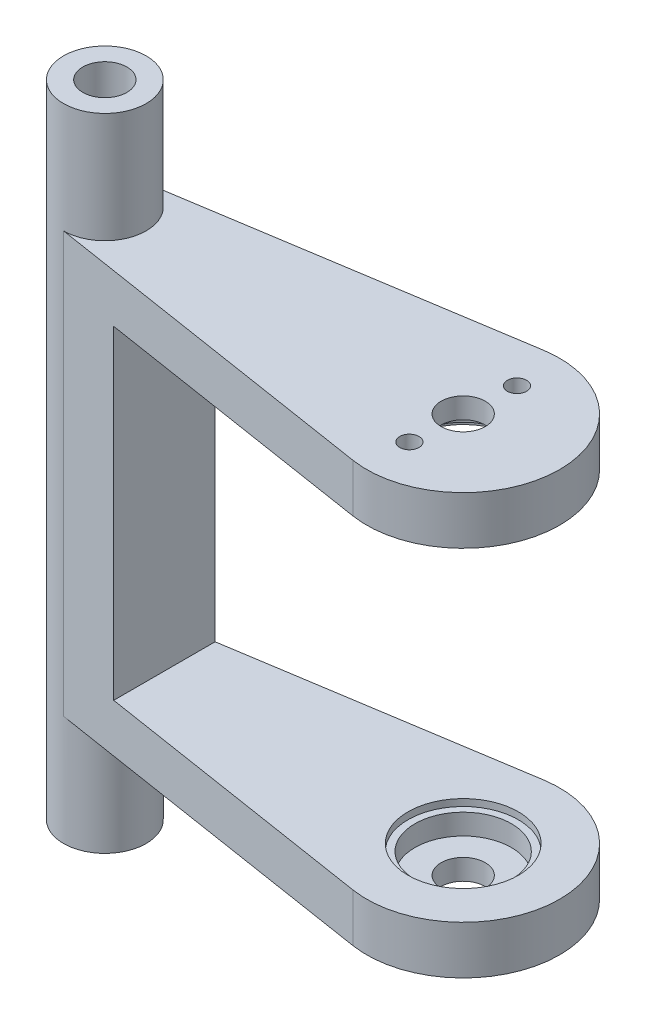
ISO-10303-21;
HEADER;
FILE_DESCRIPTION(('STEP AP214'),'2;1');
FILE_NAME('part.step','',(''),(''),'','','');
FILE_SCHEMA(('AUTOMOTIVE_DESIGN { 1 0 10303 214 1 1 1 1 }'));
ENDSEC;
DATA;
#1=APPLICATION_CONTEXT('core data for automotive mechanical design processes');
#2=APPLICATION_PROTOCOL_DEFINITION('international standard','automotive_design',2000,#1);
#3=PRODUCT_CONTEXT('',#1,'mechanical');
#4=PRODUCT('Part','Part','',(#3));
#5=PRODUCT_RELATED_PRODUCT_CATEGORY('part','',(#4));
#6=PRODUCT_DEFINITION_FORMATION('','',#4);
#7=PRODUCT_DEFINITION_CONTEXT('part definition',#1,'design');
#8=PRODUCT_DEFINITION('design','',#6,#7);
#9=PRODUCT_DEFINITION_SHAPE('','',#8);
#10=(LENGTH_UNIT() NAMED_UNIT(*) SI_UNIT(.MILLI.,.METRE.));
#11=(NAMED_UNIT(*) PLANE_ANGLE_UNIT() SI_UNIT($,.RADIAN.));
#12=(NAMED_UNIT(*) SI_UNIT($,.STERADIAN.) SOLID_ANGLE_UNIT());
#13=UNCERTAINTY_MEASURE_WITH_UNIT(LENGTH_MEASURE(1.E-05),#10,'distance_accuracy_value','');
#14=(GEOMETRIC_REPRESENTATION_CONTEXT(3) GLOBAL_UNCERTAINTY_ASSIGNED_CONTEXT((#13)) GLOBAL_UNIT_ASSIGNED_CONTEXT((#10,
#11,#12)) REPRESENTATION_CONTEXT('',''));
#15=CARTESIAN_POINT('',(0.,0.,0.));
#16=DIRECTION('',(0.,0.,1.));
#17=DIRECTION('',(1.,0.,0.));
#18=AXIS2_PLACEMENT_3D('',#15,#16,#17);
#19=CARTESIAN_POINT('',(0.,0.,0.));
#20=DIRECTION('',(0.,1.,0.));
#21=DIRECTION('',(0.,0.,1.));
#22=AXIS2_PLACEMENT_3D('',#19,#20,#21);
#23=PLANE('',#22);
#24=CARTESIAN_POINT('',(0.,0.,0.));
#25=DIRECTION('',(0.,1.,0.));
#26=DIRECTION('',(0.,0.,1.));
#27=AXIS2_PLACEMENT_3D('',#24,#25,#26);
#28=CIRCLE('',#27,3.2);
#29=CARTESIAN_POINT('',(0.,0.,3.2));
#30=VERTEX_POINT('',#29);
#31=EDGE_CURVE('E162',#30,#30,#28,.T.);
#32=ORIENTED_EDGE('',*,*,#31,.T.);
#33=EDGE_LOOP('',(#32));
#34=FACE_BOUND('',#33,.T.);
#35=CARTESIAN_POINT('',(-52.,0.,0.));
#36=DIRECTION('',(0.,-1.,0.));
#37=DIRECTION('',(0.,0.,-1.));
#38=AXIS2_PLACEMENT_3D('',#35,#36,#37);
#39=CIRCLE('',#38,5.99999999999999);
#40=CARTESIAN_POINT('',(-52.,0.,-5.99999999999999));
#41=VERTEX_POINT('',#40);
#42=CARTESIAN_POINT('',(-52.,0.,6.));
#43=VERTEX_POINT('',#42);
#44=EDGE_CURVE('E104',#41,#43,#39,.T.);
#45=ORIENTED_EDGE('',*,*,#44,.F.);
#46=DIRECTION('',(0.987875985661789,0.,-0.155245086726601));
#47=VECTOR('',#46,1.);
#48=CARTESIAN_POINT('',(-2.17343127995814,0.,-13.8302642178814));
#49=LINE('',#48,#47);
#50=CARTESIAN_POINT('',(-2.17343127995814,0.,-13.8302642178814));
#51=VERTEX_POINT('',#50);
#52=EDGE_CURVE('E86',#41,#51,#49,.T.);
#53=ORIENTED_EDGE('',*,*,#52,.T.);
#54=CARTESIAN_POINT('',(0.,0.,0.));
#55=DIRECTION('',(0.,1.,0.));
#56=DIRECTION('',(0.,0.,1.));
#57=AXIS2_PLACEMENT_3D('',#54,#55,#56);
#58=CIRCLE('',#57,14.000000423754);
#59=CARTESIAN_POINT('',(-2.17343127995814,0.,13.8302642178814));
#60=VERTEX_POINT('',#59);
#61=EDGE_CURVE('E95',#60,#51,#58,.T.);
#62=ORIENTED_EDGE('',*,*,#61,.F.);
#63=DIRECTION('',(0.987875985661789,0.,0.155245086726601));
#64=VECTOR('',#63,1.);
#65=CARTESIAN_POINT('',(-2.17343127995814,0.,13.8302642178814));
#66=LINE('',#65,#64);
#67=EDGE_CURVE('E101',#43,#60,#66,.T.);
#68=ORIENTED_EDGE('',*,*,#67,.F.);
#69=EDGE_LOOP('',(#45,#53,#62,#68));
#70=FACE_BOUND('',#69,.T.);
#71=ADVANCED_FACE('F39',(#34,#70),#23,.F.);
#72=CARTESIAN_POINT('',(0.,3.,0.));
#73=DIRECTION('',(0.,1.,0.));
#74=DIRECTION('',(0.,0.,1.));
#75=AXIS2_PLACEMENT_3D('',#72,#73,#74);
#76=CYLINDRICAL_SURFACE('',#75,7.);
#77=CARTESIAN_POINT('',(0.,3.,0.));
#78=DIRECTION('',(0.,1.,0.));
#79=DIRECTION('',(0.,0.,1.));
#80=AXIS2_PLACEMENT_3D('',#77,#78,#79);
#81=CIRCLE('',#80,7.);
#82=CARTESIAN_POINT('',(0.,3.,7.));
#83=VERTEX_POINT('',#82);
#84=EDGE_CURVE('E134',#83,#83,#81,.T.);
#85=ORIENTED_EDGE('',*,*,#84,.F.);
#86=EDGE_LOOP('',(#85));
#87=FACE_BOUND('',#86,.T.);
#88=CARTESIAN_POINT('',(0.,6.,0.));
#89=DIRECTION('',(0.,1.,0.));
#90=DIRECTION('',(0.,0.,1.));
#91=AXIS2_PLACEMENT_3D('',#88,#89,#90);
#92=CIRCLE('',#91,7.);
#93=CARTESIAN_POINT('',(0.,6.,7.));
#94=VERTEX_POINT('',#93);
#95=EDGE_CURVE('E43',#94,#94,#92,.F.);
#96=ORIENTED_EDGE('',*,*,#95,.F.);
#97=EDGE_LOOP('',(#96));
#98=FACE_BOUND('',#97,.T.);
#99=ADVANCED_FACE('F307',(#87,#98),#76,.F.);
#100=CARTESIAN_POINT('',(0.,0.,0.));
#101=DIRECTION('',(0.,1.,0.));
#102=DIRECTION('',(0.,0.,1.));
#103=AXIS2_PLACEMENT_3D('',#100,#101,#102);
#104=CYLINDRICAL_SURFACE('',#103,3.2);
#105=CARTESIAN_POINT('',(0.,3.,0.));
#106=DIRECTION('',(0.,1.,0.));
#107=DIRECTION('',(0.,0.,1.));
#108=AXIS2_PLACEMENT_3D('',#105,#106,#107);
#109=CIRCLE('',#108,3.2);
#110=CARTESIAN_POINT('',(0.,3.,3.2));
#111=VERTEX_POINT('',#110);
#112=EDGE_CURVE('E130',#111,#111,#109,.F.);
#113=CARTESIAN_POINT('',(0.,0.,3.2));
#114=CARTESIAN_POINT('',(0.,0.03125,3.2));
#115=CARTESIAN_POINT('',(0.,0.0625,3.2));
#116=CARTESIAN_POINT('',(0.,0.125,3.2));
#117=CARTESIAN_POINT('',(0.,0.15625,3.2));
#118=CARTESIAN_POINT('',(0.,0.21875,3.2));
#119=CARTESIAN_POINT('',(0.,0.25,3.2));
#120=CARTESIAN_POINT('',(0.,0.3125,3.2));
#121=CARTESIAN_POINT('',(0.,0.34375,3.2));
#122=CARTESIAN_POINT('',(0.,0.40625,3.2));
#123=CARTESIAN_POINT('',(0.,0.4375,3.2));
#124=CARTESIAN_POINT('',(0.,0.5,3.2));
#125=CARTESIAN_POINT('',(0.,0.53125,3.2));
#126=CARTESIAN_POINT('',(0.,0.59375,3.2));
#127=CARTESIAN_POINT('',(0.,0.625,3.2));
#128=CARTESIAN_POINT('',(0.,0.6875,3.2));
#129=CARTESIAN_POINT('',(0.,0.71875,3.2));
#130=CARTESIAN_POINT('',(0.,0.78125,3.2));
#131=CARTESIAN_POINT('',(0.,0.8125,3.2));
#132=CARTESIAN_POINT('',(0.,0.875,3.2));
#133=CARTESIAN_POINT('',(0.,0.90625,3.2));
#134=CARTESIAN_POINT('',(0.,0.96875,3.2));
#135=CARTESIAN_POINT('',(0.,1.,3.2));
#136=CARTESIAN_POINT('',(0.,1.0625,3.2));
#137=CARTESIAN_POINT('',(0.,1.09375,3.2));
#138=CARTESIAN_POINT('',(0.,1.15625,3.2));
#139=CARTESIAN_POINT('',(0.,1.1875,3.2));
#140=CARTESIAN_POINT('',(0.,1.25,3.2));
#141=CARTESIAN_POINT('',(0.,1.28125,3.2));
#142=CARTESIAN_POINT('',(0.,1.34375,3.2));
#143=CARTESIAN_POINT('',(0.,1.375,3.2));
#144=CARTESIAN_POINT('',(0.,1.4375,3.2));
#145=CARTESIAN_POINT('',(0.,1.46875,3.2));
#146=CARTESIAN_POINT('',(0.,1.53125,3.2));
#147=CARTESIAN_POINT('',(0.,1.5625,3.2));
#148=CARTESIAN_POINT('',(0.,1.625,3.2));
#149=CARTESIAN_POINT('',(0.,1.65625,3.2));
#150=CARTESIAN_POINT('',(0.,1.71875,3.2));
#151=CARTESIAN_POINT('',(0.,1.75,3.2));
#152=CARTESIAN_POINT('',(0.,1.8125,3.2));
#153=CARTESIAN_POINT('',(0.,1.84375,3.2));
#154=CARTESIAN_POINT('',(0.,1.90625,3.2));
#155=CARTESIAN_POINT('',(0.,1.9375,3.2));
#156=CARTESIAN_POINT('',(0.,2.,3.2));
#157=CARTESIAN_POINT('',(0.,2.03125,3.2));
#158=CARTESIAN_POINT('',(0.,2.09375,3.2));
#159=CARTESIAN_POINT('',(0.,2.125,3.2));
#160=CARTESIAN_POINT('',(0.,2.1875,3.2));
#161=CARTESIAN_POINT('',(0.,2.21875,3.2));
#162=CARTESIAN_POINT('',(0.,2.28125,3.2));
#163=CARTESIAN_POINT('',(0.,2.3125,3.2));
#164=CARTESIAN_POINT('',(0.,2.375,3.2));
#165=CARTESIAN_POINT('',(0.,2.40625,3.2));
#166=CARTESIAN_POINT('',(0.,2.46875,3.2));
#167=CARTESIAN_POINT('',(0.,2.5,3.2));
#168=CARTESIAN_POINT('',(0.,2.5625,3.2));
#169=CARTESIAN_POINT('',(0.,2.59375,3.2));
#170=CARTESIAN_POINT('',(0.,2.65625,3.2));
#171=CARTESIAN_POINT('',(0.,2.6875,3.2));
#172=CARTESIAN_POINT('',(0.,2.75,3.2));
#173=CARTESIAN_POINT('',(0.,2.78125,3.2));
#174=CARTESIAN_POINT('',(0.,2.84375,3.2));
#175=CARTESIAN_POINT('',(0.,2.875,3.2));
#176=CARTESIAN_POINT('',(0.,2.9375,3.2));
#177=CARTESIAN_POINT('',(0.,2.96875,3.2));
#178=CARTESIAN_POINT('',(0.,3.,3.2));
#179=B_SPLINE_CURVE_WITH_KNOTS('',3,(#113,#114,#115,#116,#117,#118,#119,#120,#121,#122,#123,
#124,#125,#126,#127,#128,#129,#130,#131,#132,#133,#134,#135,#136,#137,#138,#139,#140,#141,#142,
#143,#144,#145,#146,#147,#148,#149,#150,#151,#152,#153,#154,#155,#156,#157,#158,#159,#160,#161,
#162,#163,#164,#165,#166,#167,#168,#169,#170,#171,#172,#173,#174,#175,#176,#177,#178),
.UNSPECIFIED.,.F.,.F.,(4,2,2,2,2,2,2,2,2,2,2,2,2,2,2,2,2,2,2,2,2,2,2,2,2,2,2,2,2,2,2,2,4),(0.,
0.09375,0.1875,0.28125,0.375,0.46875,0.5625,0.65625,0.75,0.84375,0.9375,1.03125,1.125,1.21875,
1.3125,1.40625,1.5,1.59375,1.6875,1.78125,1.875,1.96875,2.0625,2.15625,2.25,2.34375,2.4375,
2.53125,2.625,2.71875,2.8125,2.90625,3.),.UNSPECIFIED.);
#180=EDGE_CURVE('BSEAM303',#30,#111,#179,.T.);
#181=ORIENTED_EDGE('',*,*,#31,.F.);
#182=ORIENTED_EDGE('',*,*,#112,.F.);
#183=ORIENTED_EDGE('',*,*,#180,.T.);
#184=ORIENTED_EDGE('',*,*,#180,.F.);
#185=EDGE_LOOP('',(#181,#183,#182,#184));
#186=FACE_BOUND('',#185,.T.);
#187=ADVANCED_FACE('F303',(#186),#104,.F.);
#188=CARTESIAN_POINT('',(0.,58.,0.));
#189=DIRECTION('',(0.,-1.,0.));
#190=DIRECTION('',(0.,0.,-1.));
#191=AXIS2_PLACEMENT_3D('',#188,#189,#190);
#192=CYLINDRICAL_SURFACE('',#191,7.);
#193=CARTESIAN_POINT('',(0.,58.,0.));
#194=DIRECTION('',(0.,-1.,0.));
#195=DIRECTION('',(0.,0.,-1.));
#196=AXIS2_PLACEMENT_3D('',#193,#194,#195);
#197=CIRCLE('',#196,7.);
#198=CARTESIAN_POINT('',(0.,58.,-7.));
#199=VERTEX_POINT('',#198);
#200=EDGE_CURVE('E125',#199,#199,#197,.T.);
#201=ORIENTED_EDGE('',*,*,#200,.F.);
#202=EDGE_LOOP('',(#201));
#203=FACE_BOUND('',#202,.T.);
#204=CARTESIAN_POINT('',(0.,55.,0.));
#205=DIRECTION('',(0.,-1.,0.));
#206=DIRECTION('',(0.,0.,-1.));
#207=AXIS2_PLACEMENT_3D('',#204,#205,#206);
#208=CIRCLE('',#207,7.);
#209=CARTESIAN_POINT('',(0.,55.,-7.));
#210=VERTEX_POINT('',#209);
#211=EDGE_CURVE('E126',#210,#210,#208,.F.);
#212=ORIENTED_EDGE('',*,*,#211,.F.);
#213=EDGE_LOOP('',(#212));
#214=FACE_BOUND('',#213,.T.);
#215=ADVANCED_FACE('F300',(#203,#214),#192,.F.);
#216=CARTESIAN_POINT('',(0.,61.,0.));
#217=DIRECTION('',(0.,1.,0.));
#218=DIRECTION('',(0.,0.,1.));
#219=AXIS2_PLACEMENT_3D('',#216,#217,#218);
#220=CIRCLE('',#219,3.2);
#221=CARTESIAN_POINT('',(0.,61.,3.2));
#222=VERTEX_POINT('',#221);
#223=EDGE_CURVE('E177',#222,#222,#220,.T.);
#224=CARTESIAN_POINT('',(0.,58.,0.));
#225=DIRECTION('',(0.,-1.,0.));
#226=DIRECTION('',(0.,0.,-1.));
#227=AXIS2_PLACEMENT_3D('',#224,#225,#226);
#228=CIRCLE('',#227,3.2);
#229=CARTESIAN_POINT('',(0.,58.,3.2));
#230=VERTEX_POINT('',#229);
#231=EDGE_CURVE('E120',#230,#230,#228,.F.);
#232=CARTESIAN_POINT('',(0.,61.,3.2));
#233=CARTESIAN_POINT('',(0.,60.96875,3.2));
#234=CARTESIAN_POINT('',(0.,60.9375,3.2));
#235=CARTESIAN_POINT('',(0.,60.875,3.2));
#236=CARTESIAN_POINT('',(0.,60.84375,3.2));
#237=CARTESIAN_POINT('',(0.,60.78125,3.2));
#238=CARTESIAN_POINT('',(0.,60.75,3.2));
#239=CARTESIAN_POINT('',(0.,60.6875,3.2));
#240=CARTESIAN_POINT('',(0.,60.65625,3.2));
#241=CARTESIAN_POINT('',(0.,60.59375,3.2));
#242=CARTESIAN_POINT('',(0.,60.5625,3.2));
#243=CARTESIAN_POINT('',(0.,60.5,3.2));
#244=CARTESIAN_POINT('',(0.,60.46875,3.2));
#245=CARTESIAN_POINT('',(0.,60.40625,3.2));
#246=CARTESIAN_POINT('',(0.,60.375,3.2));
#247=CARTESIAN_POINT('',(0.,60.3125,3.2));
#248=CARTESIAN_POINT('',(0.,60.28125,3.2));
#249=CARTESIAN_POINT('',(0.,60.21875,3.2));
#250=CARTESIAN_POINT('',(0.,60.1875,3.2));
#251=CARTESIAN_POINT('',(0.,60.125,3.2));
#252=CARTESIAN_POINT('',(0.,60.09375,3.2));
#253=CARTESIAN_POINT('',(0.,60.03125,3.2));
#254=CARTESIAN_POINT('',(0.,60.,3.2));
#255=CARTESIAN_POINT('',(0.,59.9375,3.2));
#256=CARTESIAN_POINT('',(0.,59.90625,3.2));
#257=CARTESIAN_POINT('',(0.,59.84375,3.2));
#258=CARTESIAN_POINT('',(0.,59.8125,3.2));
#259=CARTESIAN_POINT('',(0.,59.75,3.2));
#260=CARTESIAN_POINT('',(0.,59.71875,3.2));
#261=CARTESIAN_POINT('',(0.,59.65625,3.2));
#262=CARTESIAN_POINT('',(0.,59.625,3.2));
#263=CARTESIAN_POINT('',(0.,59.5625,3.2));
#264=CARTESIAN_POINT('',(0.,59.53125,3.2));
#265=CARTESIAN_POINT('',(0.,59.46875,3.2));
#266=CARTESIAN_POINT('',(0.,59.4375,3.2));
#267=CARTESIAN_POINT('',(0.,59.375,3.2));
#268=CARTESIAN_POINT('',(0.,59.34375,3.2));
#269=CARTESIAN_POINT('',(0.,59.28125,3.2));
#270=CARTESIAN_POINT('',(0.,59.25,3.2));
#271=CARTESIAN_POINT('',(0.,59.1875,3.2));
#272=CARTESIAN_POINT('',(0.,59.15625,3.2));
#273=CARTESIAN_POINT('',(0.,59.09375,3.2));
#274=CARTESIAN_POINT('',(0.,59.0625,3.2));
#275=CARTESIAN_POINT('',(0.,59.,3.2));
#276=CARTESIAN_POINT('',(0.,58.96875,3.2));
#277=CARTESIAN_POINT('',(0.,58.90625,3.2));
#278=CARTESIAN_POINT('',(0.,58.875,3.2));
#279=CARTESIAN_POINT('',(0.,58.8125,3.2));
#280=CARTESIAN_POINT('',(0.,58.78125,3.2));
#281=CARTESIAN_POINT('',(0.,58.71875,3.2));
#282=CARTESIAN_POINT('',(0.,58.6875,3.2));
#283=CARTESIAN_POINT('',(0.,58.625,3.2));
#284=CARTESIAN_POINT('',(0.,58.59375,3.2));
#285=CARTESIAN_POINT('',(0.,58.53125,3.2));
#286=CARTESIAN_POINT('',(0.,58.5,3.2));
#287=CARTESIAN_POINT('',(0.,58.4375,3.2));
#288=CARTESIAN_POINT('',(0.,58.40625,3.2));
#289=CARTESIAN_POINT('',(0.,58.34375,3.2));
#290=CARTESIAN_POINT('',(0.,58.3125,3.2));
#291=CARTESIAN_POINT('',(0.,58.25,3.2));
#292=CARTESIAN_POINT('',(0.,58.21875,3.2));
#293=CARTESIAN_POINT('',(0.,58.15625,3.2));
#294=CARTESIAN_POINT('',(0.,58.125,3.2));
#295=CARTESIAN_POINT('',(0.,58.0625,3.2));
#296=CARTESIAN_POINT('',(0.,58.03125,3.2));
#297=CARTESIAN_POINT('',(0.,58.,3.2));
#298=B_SPLINE_CURVE_WITH_KNOTS('',3,(#232,#233,#234,#235,#236,#237,#238,#239,#240,#241,#242,
#243,#244,#245,#246,#247,#248,#249,#250,#251,#252,#253,#254,#255,#256,#257,#258,#259,#260,#261,
#262,#263,#264,#265,#266,#267,#268,#269,#270,#271,#272,#273,#274,#275,#276,#277,#278,#279,#280,
#281,#282,#283,#284,#285,#286,#287,#288,#289,#290,#291,#292,#293,#294,#295,#296,#297),
.UNSPECIFIED.,.F.,.F.,(4,2,2,2,2,2,2,2,2,2,2,2,2,2,2,2,2,2,2,2,2,2,2,2,2,2,2,2,2,2,2,2,4),(0.,
0.0937499999999966,0.1875,0.281249999999997,0.375,0.468749999999997,0.5625,0.656249999999997,
0.750000000000001,0.843749999999997,0.937499999999994,1.03125,1.12499999999999,1.21875,
1.31249999999999,1.40625,1.49999999999999,1.59374999999999,1.68749999999999,1.78124999999999,
1.87499999999999,1.96874999999999,2.06249999999999,2.15624999999999,2.24999999999999,
2.34374999999999,2.43749999999999,2.53124999999999,2.62499999999999,2.71874999999999,
2.81249999999999,2.90624999999999,2.99999999999999),.UNSPECIFIED.);
#299=EDGE_CURVE('BSEAM294',#222,#230,#298,.T.);
#300=ORIENTED_EDGE('',*,*,#223,.T.);
#301=ORIENTED_EDGE('',*,*,#231,.F.);
#302=ORIENTED_EDGE('',*,*,#299,.T.);
#303=ORIENTED_EDGE('',*,*,#299,.F.);
#304=EDGE_LOOP('',(#300,#302,#301,#303));
#305=FACE_BOUND('',#304,.T.);
#306=ADVANCED_FACE('F294',(#305),#104,.F.);
#307=CARTESIAN_POINT('',(0.,7.,0.));
#308=DIRECTION('',(0.,1.,0.));
#309=DIRECTION('',(0.,0.,1.));
#310=AXIS2_PLACEMENT_3D('',#307,#308,#309);
#311=PLANE('',#310);
#312=CARTESIAN_POINT('',(0.,7.,0.));
#313=DIRECTION('',(0.,1.,0.));
#314=DIRECTION('',(0.,0.,1.));
#315=AXIS2_PLACEMENT_3D('',#312,#313,#314);
#316=CIRCLE('',#315,8.);
#317=CARTESIAN_POINT('',(0.,7.,8.));
#318=VERTEX_POINT('',#317);
#319=EDGE_CURVE('E150',#318,#318,#316,.T.);
#320=ORIENTED_EDGE('',*,*,#319,.F.);
#321=EDGE_LOOP('',(#320));
#322=FACE_BOUND('',#321,.T.);
#323=DIRECTION('',(0.987875985661789,0.,-0.155245086726601));
#324=VECTOR('',#323,1.);
#325=CARTESIAN_POINT('',(-2.17343127995814,7.,-13.8302642178814));
#326=LINE('',#325,#324);
#327=CARTESIAN_POINT('',(-43.3576983044888,7.,-7.35814099715995));
#328=VERTEX_POINT('',#327);
#329=CARTESIAN_POINT('',(-2.17343127995814,7.,-13.8302642178814));
#330=VERTEX_POINT('',#329);
#331=EDGE_CURVE('E66',#328,#330,#326,.T.);
#332=ORIENTED_EDGE('',*,*,#331,.F.);
#333=DIRECTION('',(0.,0.,1.));
#334=VECTOR('',#333,1.);
#335=CARTESIAN_POINT('',(-43.3576983044888,7.,0.));
#336=LINE('',#335,#334);
#337=CARTESIAN_POINT('',(-43.3576983044888,7.,7.35814099715996));
#338=VERTEX_POINT('',#337);
#339=EDGE_CURVE('E217',#328,#338,#336,.T.);
#340=ORIENTED_EDGE('',*,*,#339,.T.);
#341=DIRECTION('',(0.987875985661789,0.,0.155245086726601));
#342=VECTOR('',#341,1.);
#343=CARTESIAN_POINT('',(-2.17343127995814,7.,13.8302642178814));
#344=LINE('',#343,#342);
#345=CARTESIAN_POINT('',(-2.17343127995814,7.,13.8302642178814));
#346=VERTEX_POINT('',#345);
#347=EDGE_CURVE('E226',#338,#346,#344,.T.);
#348=ORIENTED_EDGE('',*,*,#347,.T.);
#349=CARTESIAN_POINT('',(0.,7.,0.));
#350=DIRECTION('',(0.,1.,0.));
#351=DIRECTION('',(0.,0.,1.));
#352=AXIS2_PLACEMENT_3D('',#349,#350,#351);
#353=CIRCLE('',#352,14.000000423754);
#354=EDGE_CURVE('E91',#346,#330,#353,.T.);
#355=ORIENTED_EDGE('',*,*,#354,.T.);
#356=EDGE_LOOP('',(#332,#340,#348,#355));
#357=FACE_BOUND('',#356,.T.);
#358=ADVANCED_FACE('F231',(#322,#357),#311,.T.);
#359=CARTESIAN_POINT('',(-2.17343127995814,7.,-13.8302642178814));
#360=DIRECTION('',(-0.155245086726601,0.,-0.987875985661788));
#361=DIRECTION('',(-0.987875985661788,0.,0.155245086726601));
#362=AXIS2_PLACEMENT_3D('',#359,#360,#361);
#363=PLANE('',#362);
#364=ORIENTED_EDGE('',*,*,#52,.F.);
#365=DIRECTION('',(0.,-1.,0.));
#366=VECTOR('',#365,1.);
#367=CARTESIAN_POINT('',(-52.,7.,-5.99999999999999));
#368=LINE('',#367,#366);
#369=CARTESIAN_POINT('',(-52.,61.,-5.99999999999999));
#370=VERTEX_POINT('',#369);
#371=EDGE_CURVE('E11',#370,#41,#368,.T.);
#372=ORIENTED_EDGE('',*,*,#371,.F.);
#373=DIRECTION('',(-0.987875985661789,0.,0.155245086726601));
#374=VECTOR('',#373,1.);
#375=CARTESIAN_POINT('',(-2.17343127995814,61.,-13.8302642178814));
#376=LINE('',#375,#374);
#377=CARTESIAN_POINT('',(-43.3576983044889,61.,-7.35814099715995));
#378=VERTEX_POINT('',#377);
#379=EDGE_CURVE('E182',#378,#370,#376,.T.);
#380=ORIENTED_EDGE('',*,*,#379,.F.);
#381=DIRECTION('',(0.98787598804435,0.,-0.155245071565571));
#382=VECTOR('',#381,1.);
#383=CARTESIAN_POINT('',(-2.17343106770371,61.,-13.8302642512373));
#384=LINE('',#383,#382);
#385=CARTESIAN_POINT('',(-2.17343106770371,61.,-13.8302642512373));
#386=VERTEX_POINT('',#385);
#387=EDGE_CURVE('E195',#378,#386,#384,.T.);
#388=ORIENTED_EDGE('',*,*,#387,.T.);
#389=DIRECTION('',(0.,-1.,0.));
#390=VECTOR('',#389,1.);
#391=CARTESIAN_POINT('',(-2.17343106770371,61.,-13.8302642512373));
#392=LINE('',#391,#390);
#393=CARTESIAN_POINT('',(-2.17343106770371,54.,-13.8302642512373));
#394=VERTEX_POINT('',#393);
#395=EDGE_CURVE('E199',#386,#394,#392,.T.);
#396=ORIENTED_EDGE('',*,*,#395,.T.);
#397=DIRECTION('',(0.98787598804435,0.,-0.155245071565571));
#398=VECTOR('',#397,1.);
#399=CARTESIAN_POINT('',(-2.17343106770371,54.,-13.8302642512373));
#400=LINE('',#399,#398);
#401=CARTESIAN_POINT('',(-43.3576983044889,54.,-7.35814099715995));
#402=VERTEX_POINT('',#401);
#403=EDGE_CURVE('E187',#402,#394,#400,.T.);
#404=ORIENTED_EDGE('',*,*,#403,.F.);
#405=DIRECTION('',(0.,-1.,0.));
#406=VECTOR('',#405,1.);
#407=CARTESIAN_POINT('',(-43.3576983044888,54.,-7.35814099715995));
#408=LINE('',#407,#406);
#409=EDGE_CURVE('E110',#402,#328,#408,.T.);
#410=ORIENTED_EDGE('',*,*,#409,.T.);
#411=ORIENTED_EDGE('',*,*,#331,.T.);
#412=DIRECTION('',(0.,-1.,0.));
#413=VECTOR('',#412,1.);
#414=CARTESIAN_POINT('',(-2.17343127995814,7.,-13.8302642178814));
#415=LINE('',#414,#413);
#416=EDGE_CURVE('E81',#330,#51,#415,.T.);
#417=ORIENTED_EDGE('',*,*,#416,.T.);
#418=EDGE_LOOP('',(#364,#372,#380,#388,#396,#404,#410,#411,#417));
#419=FACE_BOUND('',#418,.T.);
#420=ADVANCED_FACE('F41',(#419),#363,.T.);
#421=CARTESIAN_POINT('',(-52.,7.,0.));
#422=DIRECTION('',(0.,-1.,0.));
#423=DIRECTION('',(0.,0.,-1.));
#424=AXIS2_PLACEMENT_3D('',#421,#422,#423);
#425=CYLINDRICAL_SURFACE('',#424,5.99999999999999);
#426=ORIENTED_EDGE('',*,*,#371,.T.);
#427=ORIENTED_EDGE('',*,*,#44,.T.);
#428=DIRECTION('',(0.,-1.,0.));
#429=VECTOR('',#428,1.);
#430=CARTESIAN_POINT('',(-52.,7.,6.));
#431=LINE('',#430,#429);
#432=CARTESIAN_POINT('',(-52.,61.,6.));
#433=VERTEX_POINT('',#432);
#434=EDGE_CURVE('E49',#433,#43,#431,.T.);
#435=ORIENTED_EDGE('',*,*,#434,.F.);
#436=CARTESIAN_POINT('',(-52.,61.,0.));
#437=DIRECTION('',(0.,1.,0.));
#438=DIRECTION('',(0.,0.,1.));
#439=AXIS2_PLACEMENT_3D('',#436,#437,#438);
#440=CIRCLE('',#439,5.99999999999999);
#441=EDGE_CURVE('E268',#433,#370,#440,.T.);
#442=ORIENTED_EDGE('',*,*,#441,.T.);
#443=EDGE_LOOP('',(#426,#427,#435,#442));
#444=FACE_BOUND('',#443,.T.);
#445=CARTESIAN_POINT('',(-52.,77.,0.));
#446=DIRECTION('',(0.,1.,0.));
#447=DIRECTION('',(0.,0.,1.));
#448=AXIS2_PLACEMENT_3D('',#445,#446,#447);
#449=CIRCLE('',#448,5.99999999999999);
#450=CARTESIAN_POINT('',(-52.,77.,6.));
#451=VERTEX_POINT('',#450);
#452=EDGE_CURVE('E273',#451,#451,#449,.T.);
#453=ORIENTED_EDGE('',*,*,#452,.F.);
#454=EDGE_LOOP('',(#453));
#455=FACE_BOUND('',#454,.T.);
#456=CARTESIAN_POINT('',(-52.,-16.,0.));
#457=DIRECTION('',(0.,-1.,0.));
#458=DIRECTION('',(0.,0.,-1.));
#459=AXIS2_PLACEMENT_3D('',#456,#457,#458);
#460=CIRCLE('',#459,5.99999999999999);
#461=CARTESIAN_POINT('',(-52.,-16.,-5.99999999999999));
#462=VERTEX_POINT('',#461);
#463=EDGE_CURVE('E281',#462,#462,#460,.T.);
#464=ORIENTED_EDGE('',*,*,#463,.F.);
#465=EDGE_LOOP('',(#464));
#466=FACE_BOUND('',#465,.T.);
#467=ADVANCED_FACE('F266',(#444,#455,#466),#425,.T.);
#468=CARTESIAN_POINT('',(-2.17343127995814,7.,13.8302642178814));
#469=DIRECTION('',(0.155245086726601,0.,-0.987875985661788));
#470=DIRECTION('',(-0.987875985661788,0.,-0.155245086726601));
#471=AXIS2_PLACEMENT_3D('',#468,#469,#470);
#472=PLANE('',#471);
#473=ORIENTED_EDGE('',*,*,#67,.T.);
#474=DIRECTION('',(0.,-1.,0.));
#475=VECTOR('',#474,1.);
#476=CARTESIAN_POINT('',(-2.17343127995814,7.,13.8302642178814));
#477=LINE('',#476,#475);
#478=EDGE_CURVE('E90',#346,#60,#477,.T.);
#479=ORIENTED_EDGE('',*,*,#478,.F.);
#480=ORIENTED_EDGE('',*,*,#347,.F.);
#481=DIRECTION('',(0.,-1.,0.));
#482=VECTOR('',#481,1.);
#483=CARTESIAN_POINT('',(-43.3576983044888,54.,7.35814099715996));
#484=LINE('',#483,#482);
#485=CARTESIAN_POINT('',(-43.3576983044888,54.,7.35814099715996));
#486=VERTEX_POINT('',#485);
#487=EDGE_CURVE('E57',#486,#338,#484,.T.);
#488=ORIENTED_EDGE('',*,*,#487,.F.);
#489=DIRECTION('',(0.987875985661789,0.,0.155245086726601));
#490=VECTOR('',#489,1.);
#491=CARTESIAN_POINT('',(-2.17343127995814,54.,13.8302642178814));
#492=LINE('',#491,#490);
#493=CARTESIAN_POINT('',(-2.17343127995814,54.,13.8302642178814));
#494=VERTEX_POINT('',#493);
#495=EDGE_CURVE('E181',#486,#494,#492,.T.);
#496=ORIENTED_EDGE('',*,*,#495,.T.);
#497=DIRECTION('',(0.,-1.,0.));
#498=VECTOR('',#497,1.);
#499=CARTESIAN_POINT('',(-2.17343127995814,61.,13.8302642178814));
#500=LINE('',#499,#498);
#501=CARTESIAN_POINT('',(-2.17343127995814,61.,13.8302642178814));
#502=VERTEX_POINT('',#501);
#503=EDGE_CURVE('E213',#502,#494,#500,.T.);
#504=ORIENTED_EDGE('',*,*,#503,.F.);
#505=DIRECTION('',(0.987875985661789,0.,0.155245086726601));
#506=VECTOR('',#505,1.);
#507=CARTESIAN_POINT('',(-2.17343127995814,61.,13.8302642178814));
#508=LINE('',#507,#506);
#509=EDGE_CURVE('E186',#433,#502,#508,.T.);
#510=ORIENTED_EDGE('',*,*,#509,.F.);
#511=ORIENTED_EDGE('',*,*,#434,.T.);
#512=EDGE_LOOP('',(#473,#479,#480,#488,#496,#504,#510,#511));
#513=FACE_BOUND('',#512,.T.);
#514=ADVANCED_FACE('F260',(#513),#472,.F.);
#515=CARTESIAN_POINT('',(0.,7.,0.));
#516=DIRECTION('',(0.,-1.,0.));
#517=DIRECTION('',(0.,0.,-1.));
#518=AXIS2_PLACEMENT_3D('',#515,#516,#517);
#519=CYLINDRICAL_SURFACE('',#518,14.000000423754);
#520=ORIENTED_EDGE('',*,*,#61,.T.);
#521=ORIENTED_EDGE('',*,*,#416,.F.);
#522=ORIENTED_EDGE('',*,*,#354,.F.);
#523=ORIENTED_EDGE('',*,*,#478,.T.);
#524=EDGE_LOOP('',(#520,#521,#522,#523));
#525=FACE_BOUND('',#524,.T.);
#526=ADVANCED_FACE('F96',(#525),#519,.T.);
#527=CARTESIAN_POINT('',(-52.,7.,0.));
#528=DIRECTION('',(0.,-1.,0.));
#529=DIRECTION('',(0.,0.,-1.));
#530=AXIS2_PLACEMENT_3D('',#527,#528,#529);
#531=CYLINDRICAL_SURFACE('',#530,3.2);
#532=CARTESIAN_POINT('',(-52.,77.,0.));
#533=DIRECTION('',(0.,1.,0.));
#534=DIRECTION('',(0.,0.,1.));
#535=AXIS2_PLACEMENT_3D('',#532,#533,#534);
#536=CIRCLE('',#535,3.2);
#537=CARTESIAN_POINT('',(-52.,77.,3.20000000000001));
#538=VERTEX_POINT('',#537);
#539=EDGE_CURVE('E274',#538,#538,#536,.T.);
#540=ORIENTED_EDGE('',*,*,#539,.T.);
#541=EDGE_LOOP('',(#540));
#542=FACE_BOUND('',#541,.T.);
#543=CARTESIAN_POINT('',(-52.,-16.,0.));
#544=DIRECTION('',(0.,-1.,0.));
#545=DIRECTION('',(0.,0.,-1.));
#546=AXIS2_PLACEMENT_3D('',#543,#544,#545);
#547=CIRCLE('',#546,3.2);
#548=CARTESIAN_POINT('',(-52.,-16.,-3.2));
#549=VERTEX_POINT('',#548);
#550=EDGE_CURVE('E674',#549,#549,#547,.T.);
#551=ORIENTED_EDGE('',*,*,#550,.T.);
#552=EDGE_LOOP('',(#551));
#553=FACE_BOUND('',#552,.T.);
#554=ADVANCED_FACE('F315',(#542,#553),#531,.F.);
#555=CARTESIAN_POINT('',(-43.3576983044888,54.,0.));
#556=DIRECTION('',(1.,0.,0.));
#557=DIRECTION('',(0.,0.,-1.));
#558=AXIS2_PLACEMENT_3D('',#555,#556,#557);
#559=PLANE('',#558);
#560=ORIENTED_EDGE('',*,*,#339,.F.);
#561=ORIENTED_EDGE('',*,*,#409,.F.);
#562=DIRECTION('',(0.,0.,1.));
#563=VECTOR('',#562,1.);
#564=CARTESIAN_POINT('',(-43.3576983044888,54.,0.));
#565=LINE('',#564,#563);
#566=EDGE_CURVE('E218',#402,#486,#565,.T.);
#567=ORIENTED_EDGE('',*,*,#566,.T.);
#568=ORIENTED_EDGE('',*,*,#487,.T.);
#569=EDGE_LOOP('',(#560,#561,#567,#568));
#570=FACE_BOUND('',#569,.T.);
#571=ADVANCED_FACE('F318',(#570),#559,.T.);
#572=CARTESIAN_POINT('',(0.,61.,0.));
#573=DIRECTION('',(0.,-1.,0.));
#574=DIRECTION('',(0.,0.,-1.));
#575=AXIS2_PLACEMENT_3D('',#572,#573,#574);
#576=CYLINDRICAL_SURFACE('',#575,14.000000423754);
#577=CARTESIAN_POINT('',(0.,54.,0.));
#578=DIRECTION('',(0.,1.,0.));
#579=DIRECTION('',(0.,0.,1.));
#580=AXIS2_PLACEMENT_3D('',#577,#578,#579);
#581=CIRCLE('',#580,14.000000423754);
#582=EDGE_CURVE('E203',#494,#394,#581,.T.);
#583=ORIENTED_EDGE('',*,*,#582,.T.);
#584=ORIENTED_EDGE('',*,*,#395,.F.);
#585=CARTESIAN_POINT('',(0.,61.,0.));
#586=DIRECTION('',(0.,1.,0.));
#587=DIRECTION('',(0.,0.,1.));
#588=AXIS2_PLACEMENT_3D('',#585,#586,#587);
#589=CIRCLE('',#588,14.000000423754);
#590=EDGE_CURVE('E191',#502,#386,#589,.T.);
#591=ORIENTED_EDGE('',*,*,#590,.F.);
#592=ORIENTED_EDGE('',*,*,#503,.T.);
#593=EDGE_LOOP('',(#583,#584,#591,#592));
#594=FACE_BOUND('',#593,.T.);
#595=ADVANCED_FACE('F347',(#594),#576,.T.);
#596=CARTESIAN_POINT('',(0.,61.,0.));
#597=DIRECTION('',(0.,1.,0.));
#598=DIRECTION('',(0.,0.,1.));
#599=AXIS2_PLACEMENT_3D('',#596,#597,#598);
#600=PLANE('',#599);
#601=ORIENTED_EDGE('',*,*,#441,.F.);
#602=ORIENTED_EDGE('',*,*,#509,.T.);
#603=ORIENTED_EDGE('',*,*,#590,.T.);
#604=ORIENTED_EDGE('',*,*,#387,.F.);
#605=ORIENTED_EDGE('',*,*,#379,.T.);
#606=EDGE_LOOP('',(#601,#602,#603,#604,#605));
#607=FACE_BOUND('',#606,.T.);
#608=CARTESIAN_POINT('',(-0.370638007484513,61.,7.43296497418142));
#609=DIRECTION('',(0.,1.,0.));
#610=DIRECTION('',(0.,0.,1.));
#611=AXIS2_PLACEMENT_3D('',#608,#609,#610);
#612=CIRCLE('',#611,1.395);
#613=CARTESIAN_POINT('',(-0.370638007484513,61.,8.82796497418142));
#614=VERTEX_POINT('',#613);
#615=EDGE_CURVE('E163',#614,#614,#612,.T.);
#616=ORIENTED_EDGE('',*,*,#615,.F.);
#617=EDGE_LOOP('',(#616));
#618=FACE_BOUND('',#617,.T.);
#619=CARTESIAN_POINT('',(0.370638007484514,61.,-7.43296497418143));
#620=DIRECTION('',(0.,1.,0.));
#621=DIRECTION('',(0.,0.,1.));
#622=AXIS2_PLACEMENT_3D('',#619,#620,#621);
#623=CIRCLE('',#622,1.395);
#624=CARTESIAN_POINT('',(0.370638007484514,61.,-6.03796497418143));
#625=VERTEX_POINT('',#624);
#626=EDGE_CURVE('E167',#625,#625,#623,.T.);
#627=ORIENTED_EDGE('',*,*,#626,.F.);
#628=EDGE_LOOP('',(#627));
#629=FACE_BOUND('',#628,.T.);
#630=ORIENTED_EDGE('',*,*,#223,.F.);
#631=EDGE_LOOP('',(#630));
#632=FACE_BOUND('',#631,.T.);
#633=ADVANCED_FACE('F269',(#607,#618,#629,#632),#600,.T.);
#634=CARTESIAN_POINT('',(0.,54.,0.));
#635=DIRECTION('',(0.,1.,0.));
#636=DIRECTION('',(0.,0.,1.));
#637=AXIS2_PLACEMENT_3D('',#634,#635,#636);
#638=PLANE('',#637);
#639=CARTESIAN_POINT('',(0.,54.,0.));
#640=DIRECTION('',(0.,-1.,0.));
#641=DIRECTION('',(0.,0.,-1.));
#642=AXIS2_PLACEMENT_3D('',#639,#640,#641);
#643=CIRCLE('',#642,8.);
#644=CARTESIAN_POINT('',(0.,54.,-8.));
#645=VERTEX_POINT('',#644);
#646=EDGE_CURVE('E133',#645,#645,#643,.T.);
#647=ORIENTED_EDGE('',*,*,#646,.F.);
#648=EDGE_LOOP('',(#647));
#649=FACE_BOUND('',#648,.T.);
#650=ORIENTED_EDGE('',*,*,#566,.F.);
#651=ORIENTED_EDGE('',*,*,#403,.T.);
#652=ORIENTED_EDGE('',*,*,#582,.F.);
#653=ORIENTED_EDGE('',*,*,#495,.F.);
#654=EDGE_LOOP('',(#650,#651,#652,#653));
#655=FACE_BOUND('',#654,.T.);
#656=ADVANCED_FACE('F361',(#649,#655),#638,.F.);
#657=CARTESIAN_POINT('',(0.370638007484514,59.,-7.43296497418143));
#658=DIRECTION('',(0.,1.,0.));
#659=DIRECTION('',(0.,0.,1.));
#660=AXIS2_PLACEMENT_3D('',#657,#658,#659);
#661=CYLINDRICAL_SURFACE('',#660,1.395);
#662=CARTESIAN_POINT('',(0.370638007484514,59.,-7.43296497418143));
#663=DIRECTION('',(0.,1.,0.));
#664=DIRECTION('',(0.,0.,1.));
#665=AXIS2_PLACEMENT_3D('',#662,#663,#664);
#666=CIRCLE('',#665,1.395);
#667=CARTESIAN_POINT('',(0.370638007484514,59.,-6.03796497418143));
#668=VERTEX_POINT('',#667);
#669=EDGE_CURVE('E124',#668,#668,#666,.T.);
#670=ORIENTED_EDGE('',*,*,#669,.F.);
#671=EDGE_LOOP('',(#670));
#672=FACE_BOUND('',#671,.T.);
#673=ORIENTED_EDGE('',*,*,#626,.T.);
#674=EDGE_LOOP('',(#673));
#675=FACE_BOUND('',#674,.T.);
#676=ADVANCED_FACE('F370',(#672,#675),#661,.F.);
#677=CARTESIAN_POINT('',(0.370638007484514,59.,-7.43296497418143));
#678=DIRECTION('',(0.,1.,0.));
#679=DIRECTION('',(0.,0.,1.));
#680=AXIS2_PLACEMENT_3D('',#677,#678,#679);
#681=PLANE('',#680);
#682=ORIENTED_EDGE('',*,*,#669,.T.);
#683=EDGE_LOOP('',(#682));
#684=FACE_BOUND('',#683,.T.);
#685=ADVANCED_FACE('F379',(#684),#681,.T.);
#686=CARTESIAN_POINT('',(-0.370638007484513,59.,7.43296497418142));
#687=DIRECTION('',(0.,1.,0.));
#688=DIRECTION('',(0.,0.,1.));
#689=AXIS2_PLACEMENT_3D('',#686,#687,#688);
#690=CYLINDRICAL_SURFACE('',#689,1.395);
#691=CARTESIAN_POINT('',(-0.370638007484513,59.,7.43296497418142));
#692=DIRECTION('',(0.,1.,0.));
#693=DIRECTION('',(0.,0.,1.));
#694=AXIS2_PLACEMENT_3D('',#691,#692,#693);
#695=CIRCLE('',#694,1.395);
#696=CARTESIAN_POINT('',(-0.370638007484513,59.,8.82796497418142));
#697=VERTEX_POINT('',#696);
#698=EDGE_CURVE('E158',#697,#697,#695,.T.);
#699=ORIENTED_EDGE('',*,*,#698,.F.);
#700=EDGE_LOOP('',(#699));
#701=FACE_BOUND('',#700,.T.);
#702=ORIENTED_EDGE('',*,*,#615,.T.);
#703=EDGE_LOOP('',(#702));
#704=FACE_BOUND('',#703,.T.);
#705=ADVANCED_FACE('F387',(#701,#704),#690,.F.);
#706=CARTESIAN_POINT('',(-0.370638007484513,59.,7.43296497418142));
#707=DIRECTION('',(0.,1.,0.));
#708=DIRECTION('',(0.,0.,1.));
#709=AXIS2_PLACEMENT_3D('',#706,#707,#708);
#710=PLANE('',#709);
#711=ORIENTED_EDGE('',*,*,#698,.T.);
#712=EDGE_LOOP('',(#711));
#713=FACE_BOUND('',#712,.T.);
#714=ADVANCED_FACE('F395',(#713),#710,.T.);
#715=CARTESIAN_POINT('',(0.,58.,0.));
#716=DIRECTION('',(0.,-1.,0.));
#717=DIRECTION('',(0.,0.,-1.));
#718=AXIS2_PLACEMENT_3D('',#715,#716,#717);
#719=PLANE('',#718);
#720=ORIENTED_EDGE('',*,*,#200,.T.);
#721=EDGE_LOOP('',(#720));
#722=FACE_BOUND('',#721,.T.);
#723=ORIENTED_EDGE('',*,*,#231,.T.);
#724=EDGE_LOOP('',(#723));
#725=FACE_BOUND('',#724,.T.);
#726=ADVANCED_FACE('F403',(#722,#725),#719,.T.);
#727=CARTESIAN_POINT('',(0.,55.,0.));
#728=DIRECTION('',(0.,-1.,0.));
#729=DIRECTION('',(0.,0.,-1.));
#730=AXIS2_PLACEMENT_3D('',#727,#728,#729);
#731=PLANE('',#730);
#732=CARTESIAN_POINT('',(0.,55.,0.));
#733=DIRECTION('',(0.,-1.,0.));
#734=DIRECTION('',(0.,0.,-1.));
#735=AXIS2_PLACEMENT_3D('',#732,#733,#734);
#736=CIRCLE('',#735,8.);
#737=CARTESIAN_POINT('',(0.,55.,-8.));
#738=VERTEX_POINT('',#737);
#739=EDGE_CURVE('E129',#738,#738,#736,.T.);
#740=ORIENTED_EDGE('',*,*,#739,.T.);
#741=EDGE_LOOP('',(#740));
#742=FACE_BOUND('',#741,.T.);
#743=ORIENTED_EDGE('',*,*,#211,.T.);
#744=EDGE_LOOP('',(#743));
#745=FACE_BOUND('',#744,.T.);
#746=ADVANCED_FACE('F412',(#742,#745),#731,.T.);
#747=CARTESIAN_POINT('',(0.,55.,0.));
#748=DIRECTION('',(0.,-1.,0.));
#749=DIRECTION('',(0.,0.,-1.));
#750=AXIS2_PLACEMENT_3D('',#747,#748,#749);
#751=CYLINDRICAL_SURFACE('',#750,8.);
#752=ORIENTED_EDGE('',*,*,#739,.F.);
#753=EDGE_LOOP('',(#752));
#754=FACE_BOUND('',#753,.T.);
#755=ORIENTED_EDGE('',*,*,#646,.T.);
#756=EDGE_LOOP('',(#755));
#757=FACE_BOUND('',#756,.T.);
#758=ADVANCED_FACE('F419',(#754,#757),#751,.F.);
#759=CARTESIAN_POINT('',(0.,3.,0.));
#760=DIRECTION('',(0.,1.,0.));
#761=DIRECTION('',(0.,0.,1.));
#762=AXIS2_PLACEMENT_3D('',#759,#760,#761);
#763=PLANE('',#762);
#764=ORIENTED_EDGE('',*,*,#84,.T.);
#765=EDGE_LOOP('',(#764));
#766=FACE_BOUND('',#765,.T.);
#767=ORIENTED_EDGE('',*,*,#112,.T.);
#768=EDGE_LOOP('',(#767));
#769=FACE_BOUND('',#768,.T.);
#770=ADVANCED_FACE('F427',(#766,#769),#763,.T.);
#771=CARTESIAN_POINT('',(0.,6.,0.));
#772=DIRECTION('',(0.,1.,0.));
#773=DIRECTION('',(0.,0.,1.));
#774=AXIS2_PLACEMENT_3D('',#771,#772,#773);
#775=PLANE('',#774);
#776=CARTESIAN_POINT('',(0.,6.,0.));
#777=DIRECTION('',(0.,1.,0.));
#778=DIRECTION('',(0.,0.,1.));
#779=AXIS2_PLACEMENT_3D('',#776,#777,#778);
#780=CIRCLE('',#779,8.);
#781=CARTESIAN_POINT('',(0.,6.,8.));
#782=VERTEX_POINT('',#781);
#783=EDGE_CURVE('E147',#782,#782,#780,.T.);
#784=ORIENTED_EDGE('',*,*,#783,.T.);
#785=EDGE_LOOP('',(#784));
#786=FACE_BOUND('',#785,.T.);
#787=ORIENTED_EDGE('',*,*,#95,.T.);
#788=EDGE_LOOP('',(#787));
#789=FACE_BOUND('',#788,.T.);
#790=ADVANCED_FACE('F436',(#786,#789),#775,.T.);
#791=CARTESIAN_POINT('',(0.,6.,0.));
#792=DIRECTION('',(0.,1.,0.));
#793=DIRECTION('',(0.,0.,1.));
#794=AXIS2_PLACEMENT_3D('',#791,#792,#793);
#795=CYLINDRICAL_SURFACE('',#794,8.);
#796=ORIENTED_EDGE('',*,*,#783,.F.);
#797=EDGE_LOOP('',(#796));
#798=FACE_BOUND('',#797,.T.);
#799=ORIENTED_EDGE('',*,*,#319,.T.);
#800=EDGE_LOOP('',(#799));
#801=FACE_BOUND('',#800,.T.);
#802=ADVANCED_FACE('F291',(#798,#801),#795,.F.);
#803=CARTESIAN_POINT('',(-52.,77.,0.));
#804=DIRECTION('',(0.,1.,0.));
#805=DIRECTION('',(0.,0.,1.));
#806=AXIS2_PLACEMENT_3D('',#803,#804,#805);
#807=PLANE('',#806);
#808=ORIENTED_EDGE('',*,*,#452,.T.);
#809=EDGE_LOOP('',(#808));
#810=FACE_BOUND('',#809,.T.);
#811=ORIENTED_EDGE('',*,*,#539,.F.);
#812=EDGE_LOOP('',(#811));
#813=FACE_BOUND('',#812,.T.);
#814=ADVANCED_FACE('F449',(#810,#813),#807,.T.);
#815=CARTESIAN_POINT('',(-52.,-16.,0.));
#816=DIRECTION('',(0.,-1.,0.));
#817=DIRECTION('',(0.,0.,-1.));
#818=AXIS2_PLACEMENT_3D('',#815,#816,#817);
#819=PLANE('',#818);
#820=ORIENTED_EDGE('',*,*,#463,.T.);
#821=EDGE_LOOP('',(#820));
#822=FACE_BOUND('',#821,.T.);
#823=ORIENTED_EDGE('',*,*,#550,.F.);
#824=EDGE_LOOP('',(#823));
#825=FACE_BOUND('',#824,.T.);
#826=ADVANCED_FACE('F456',(#822,#825),#819,.T.);
#827=CLOSED_SHELL('',(#71,#99,#187,#215,#306,#358,#420,#467,#514,#526,#554,#571,#595,#633,#656,
#676,#685,#705,#714,#726,#746,#758,#770,#790,#802,#814,#826));
#828=MANIFOLD_SOLID_BREP('B2',#827);
#829=ADVANCED_BREP_SHAPE_REPRESENTATION('',(#18,#828),#14);
#830=SHAPE_DEFINITION_REPRESENTATION(#9,#829);
ENDSEC;
END-ISO-10303-21;
